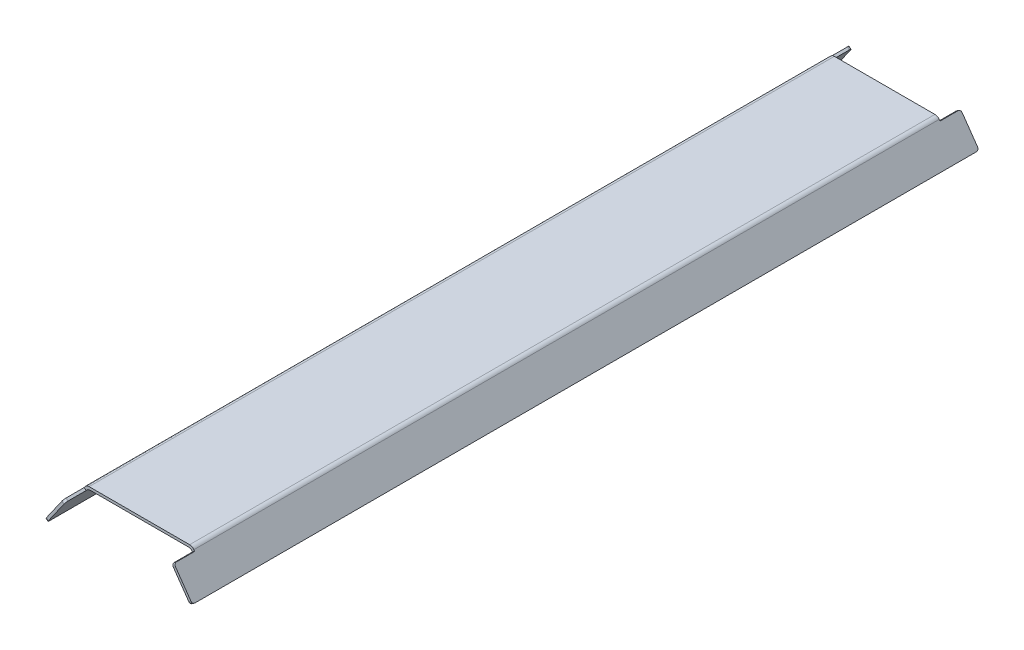
ISO-10303-21;
HEADER;
FILE_DESCRIPTION(('STEP AP214'),'2;1');
FILE_NAME('part.step','',(''),(''),'','','');
FILE_SCHEMA(('AUTOMOTIVE_DESIGN { 1 0 10303 214 1 1 1 1 }'));
ENDSEC;
DATA;
#1=APPLICATION_CONTEXT('core data for automotive mechanical design processes');
#2=APPLICATION_PROTOCOL_DEFINITION('international standard','automotive_design',2000,#1);
#3=PRODUCT_CONTEXT('',#1,'mechanical');
#4=PRODUCT('Part','Part','',(#3));
#5=PRODUCT_RELATED_PRODUCT_CATEGORY('part','',(#4));
#6=PRODUCT_DEFINITION_FORMATION('','',#4);
#7=PRODUCT_DEFINITION_CONTEXT('part definition',#1,'design');
#8=PRODUCT_DEFINITION('design','',#6,#7);
#9=PRODUCT_DEFINITION_SHAPE('','',#8);
#10=(LENGTH_UNIT() NAMED_UNIT(*) SI_UNIT(.MILLI.,.METRE.));
#11=(NAMED_UNIT(*) PLANE_ANGLE_UNIT() SI_UNIT($,.RADIAN.));
#12=(NAMED_UNIT(*) SI_UNIT($,.STERADIAN.) SOLID_ANGLE_UNIT());
#13=UNCERTAINTY_MEASURE_WITH_UNIT(LENGTH_MEASURE(1.E-05),#10,'distance_accuracy_value','');
#14=(GEOMETRIC_REPRESENTATION_CONTEXT(3) GLOBAL_UNCERTAINTY_ASSIGNED_CONTEXT((#13)) GLOBAL_UNIT_ASSIGNED_CONTEXT((#10,
#11,#12)) REPRESENTATION_CONTEXT('',''));
#15=CARTESIAN_POINT('',(0.,0.,0.));
#16=DIRECTION('',(0.,0.,1.));
#17=DIRECTION('',(1.,0.,0.));
#18=AXIS2_PLACEMENT_3D('',#15,#16,#17);
#19=CARTESIAN_POINT('',(-9.71439789499094,-1.,72.));
#20=DIRECTION('',(0.,0.,1.));
#21=DIRECTION('',(1.,0.,0.));
#22=AXIS2_PLACEMENT_3D('',#19,#20,#21);
#23=PLANE('',#22);
#24=DIRECTION('',(-0.573576436351045,-0.819152044288993,0.));
#25=VECTOR('',#24,1.);
#26=CARTESIAN_POINT('',(-10.5335499392799,-0.426423563648963,72.));
#27=LINE('',#26,#25);
#28=CARTESIAN_POINT('',(-10.5335499392799,-0.426423563648963,72.));
#29=VERTEX_POINT('',#28);
#30=CARTESIAN_POINT('',(-10.6828424361485,-0.639635345473422,72.));
#31=VERTEX_POINT('',#30);
#32=EDGE_CURVE('E343',#29,#31,#27,.T.);
#33=ORIENTED_EDGE('',*,*,#32,.T.);
#34=DIRECTION('',(0.819152044288993,-0.573576436351045,0.));
#35=VECTOR('',#34,1.);
#36=CARTESIAN_POINT('',(-10.6828424361485,-0.639635345473422,72.));
#37=LINE('',#36,#35);
#38=CARTESIAN_POINT('',(-10.2732664140041,-0.926423563648944,72.));
#39=VERTEX_POINT('',#38);
#40=EDGE_CURVE('E466',#31,#39,#37,.T.);
#41=ORIENTED_EDGE('',*,*,#40,.T.);
#42=CARTESIAN_POINT('',(-9.45411436971507,-1.5,72.));
#43=DIRECTION('',(0.,0.,-1.));
#44=DIRECTION('',(-1.,0.,0.));
#45=AXIS2_PLACEMENT_3D('',#42,#43,#44);
#46=CIRCLE('',#45,1.);
#47=CARTESIAN_POINT('',(-9.45411436971507,-0.500000000000002,72.));
#48=VERTEX_POINT('',#47);
#49=EDGE_CURVE('E347',#39,#48,#46,.T.);
#50=ORIENTED_EDGE('',*,*,#49,.T.);
#51=DIRECTION('',(-1.,0.,0.));
#52=VECTOR('',#51,1.);
#53=CARTESIAN_POINT('',(9.45411436971507,-0.5,72.));
#54=LINE('',#53,#52);
#55=CARTESIAN_POINT('',(9.45411436971507,-0.5,72.));
#56=VERTEX_POINT('',#55);
#57=EDGE_CURVE('E349',#56,#48,#54,.T.);
#58=ORIENTED_EDGE('',*,*,#57,.F.);
#59=CARTESIAN_POINT('',(9.45411436971507,-1.5,72.));
#60=DIRECTION('',(0.,0.,1.));
#61=DIRECTION('',(1.,0.,0.));
#62=AXIS2_PLACEMENT_3D('',#59,#60,#61);
#63=CIRCLE('',#62,1.);
#64=CARTESIAN_POINT('',(10.2732664140041,-0.926423563648956,72.));
#65=VERTEX_POINT('',#64);
#66=EDGE_CURVE('E352',#65,#56,#63,.T.);
#67=ORIENTED_EDGE('',*,*,#66,.F.);
#68=DIRECTION('',(-0.819152044288993,-0.573576436351045,0.));
#69=VECTOR('',#68,1.);
#70=CARTESIAN_POINT('',(10.6828424361486,-0.639635345473433,72.));
#71=LINE('',#70,#69);
#72=CARTESIAN_POINT('',(10.6828424361486,-0.639635345473434,72.));
#73=VERTEX_POINT('',#72);
#74=EDGE_CURVE('E73',#73,#65,#71,.T.);
#75=ORIENTED_EDGE('',*,*,#74,.F.);
#76=DIRECTION('',(-0.573576436351045,0.819152044288993,0.));
#77=VECTOR('',#76,1.);
#78=CARTESIAN_POINT('',(14.25,-5.73406431002295,72.));
#79=LINE('',#78,#77);
#80=CARTESIAN_POINT('',(10.5335499392799,-0.426423563648955,72.));
#81=VERTEX_POINT('',#80);
#82=EDGE_CURVE('E355',#73,#81,#79,.T.);
#83=ORIENTED_EDGE('',*,*,#82,.T.);
#84=CARTESIAN_POINT('',(9.71439789499094,-1.,72.));
#85=DIRECTION('',(0.,0.,1.));
#86=DIRECTION('',(1.,0.,0.));
#87=AXIS2_PLACEMENT_3D('',#84,#85,#86);
#88=CIRCLE('',#87,0.999999999999999);
#89=CARTESIAN_POINT('',(9.71439789499094,0.,72.));
#90=VERTEX_POINT('',#89);
#91=EDGE_CURVE('E358',#81,#90,#88,.T.);
#92=ORIENTED_EDGE('',*,*,#91,.T.);
#93=DIRECTION('',(-1.,0.,0.));
#94=VECTOR('',#93,1.);
#95=CARTESIAN_POINT('',(9.71439789499094,0.,72.));
#96=LINE('',#95,#94);
#97=CARTESIAN_POINT('',(-9.71439789499094,0.,72.));
#98=VERTEX_POINT('',#97);
#99=EDGE_CURVE('E385',#90,#98,#96,.T.);
#100=ORIENTED_EDGE('',*,*,#99,.T.);
#101=CARTESIAN_POINT('',(-9.71439789499094,-1.,72.));
#102=DIRECTION('',(0.,0.,1.));
#103=DIRECTION('',(1.,0.,0.));
#104=AXIS2_PLACEMENT_3D('',#101,#102,#103);
#105=CIRCLE('',#104,0.999999999999998);
#106=EDGE_CURVE('E340',#98,#29,#105,.T.);
#107=ORIENTED_EDGE('',*,*,#106,.T.);
#108=EDGE_LOOP('',(#33,#41,#50,#58,#67,#75,#83,#92,#100,#107));
#109=FACE_BOUND('',#108,.T.);
#110=ADVANCED_FACE('F48',(#109),#23,.T.);
#111=CARTESIAN_POINT('',(-9.71439789499094,-1.,-72.));
#112=DIRECTION('',(0.,0.,1.));
#113=DIRECTION('',(1.,0.,0.));
#114=AXIS2_PLACEMENT_3D('',#111,#112,#113);
#115=PLANE('',#114);
#116=DIRECTION('',(0.819152044288993,-0.573576436351045,0.));
#117=VECTOR('',#116,1.);
#118=CARTESIAN_POINT('',(-10.6828424361486,-0.639635345473436,-72.));
#119=LINE('',#118,#117);
#120=CARTESIAN_POINT('',(-10.6828424361486,-0.639635345473435,-72.));
#121=VERTEX_POINT('',#120);
#122=CARTESIAN_POINT('',(-10.2732664140041,-0.926423563648957,-72.));
#123=VERTEX_POINT('',#122);
#124=EDGE_CURVE('E65',#121,#123,#119,.T.);
#125=ORIENTED_EDGE('',*,*,#124,.F.);
#126=DIRECTION('',(-0.573576436351045,-0.819152044288993,0.));
#127=VECTOR('',#126,1.);
#128=CARTESIAN_POINT('',(-10.5335499392799,-0.426423563648963,-72.));
#129=LINE('',#128,#127);
#130=CARTESIAN_POINT('',(-10.5335499392799,-0.426423563648963,-72.));
#131=VERTEX_POINT('',#130);
#132=EDGE_CURVE('E427',#131,#121,#129,.T.);
#133=ORIENTED_EDGE('',*,*,#132,.F.);
#134=CARTESIAN_POINT('',(-9.71439789499094,-1.,-72.));
#135=DIRECTION('',(0.,0.,1.));
#136=DIRECTION('',(1.,0.,0.));
#137=AXIS2_PLACEMENT_3D('',#134,#135,#136);
#138=CIRCLE('',#137,0.999999999999998);
#139=CARTESIAN_POINT('',(-9.71439789499094,0.,-72.));
#140=VERTEX_POINT('',#139);
#141=EDGE_CURVE('E363',#140,#131,#138,.T.);
#142=ORIENTED_EDGE('',*,*,#141,.F.);
#143=DIRECTION('',(-1.,0.,0.));
#144=VECTOR('',#143,1.);
#145=CARTESIAN_POINT('',(9.71439789499094,0.,-72.));
#146=LINE('',#145,#144);
#147=CARTESIAN_POINT('',(9.71439789499094,0.,-72.));
#148=VERTEX_POINT('',#147);
#149=EDGE_CURVE('E344',#148,#140,#146,.T.);
#150=ORIENTED_EDGE('',*,*,#149,.F.);
#151=CARTESIAN_POINT('',(9.71439789499094,-1.,-72.));
#152=DIRECTION('',(0.,0.,1.));
#153=DIRECTION('',(1.,0.,0.));
#154=AXIS2_PLACEMENT_3D('',#151,#152,#153);
#155=CIRCLE('',#154,0.999999999999999);
#156=CARTESIAN_POINT('',(10.5335499392799,-0.426423563648955,-72.));
#157=VERTEX_POINT('',#156);
#158=EDGE_CURVE('E372',#157,#148,#155,.T.);
#159=ORIENTED_EDGE('',*,*,#158,.F.);
#160=DIRECTION('',(-0.573576436351045,0.819152044288993,0.));
#161=VECTOR('',#160,1.);
#162=CARTESIAN_POINT('',(14.25,-5.73406431002295,-72.));
#163=LINE('',#162,#161);
#164=CARTESIAN_POINT('',(10.6828424361486,-0.639635345473433,-72.));
#165=VERTEX_POINT('',#164);
#166=EDGE_CURVE('E369',#165,#157,#163,.T.);
#167=ORIENTED_EDGE('',*,*,#166,.F.);
#168=DIRECTION('',(-0.819152044288993,-0.573576436351045,0.));
#169=VECTOR('',#168,1.);
#170=CARTESIAN_POINT('',(10.6828424361486,-0.639635345473433,-72.));
#171=LINE('',#170,#169);
#172=CARTESIAN_POINT('',(10.2732664140041,-0.926423563648956,-72.));
#173=VERTEX_POINT('',#172);
#174=EDGE_CURVE('E282',#165,#173,#171,.T.);
#175=ORIENTED_EDGE('',*,*,#174,.T.);
#176=CARTESIAN_POINT('',(9.45411436971507,-1.5,-72.));
#177=DIRECTION('',(0.,0.,1.));
#178=DIRECTION('',(1.,0.,0.));
#179=AXIS2_PLACEMENT_3D('',#176,#177,#178);
#180=CIRCLE('',#179,1.);
#181=CARTESIAN_POINT('',(9.45411436971507,-0.5,-72.));
#182=VERTEX_POINT('',#181);
#183=EDGE_CURVE('E373',#173,#182,#180,.T.);
#184=ORIENTED_EDGE('',*,*,#183,.T.);
#185=DIRECTION('',(-1.,0.,0.));
#186=VECTOR('',#185,1.);
#187=CARTESIAN_POINT('',(9.45411436971507,-0.5,-72.));
#188=LINE('',#187,#186);
#189=CARTESIAN_POINT('',(-9.45411436971507,-0.500000000000002,-72.));
#190=VERTEX_POINT('',#189);
#191=EDGE_CURVE('E434',#182,#190,#188,.T.);
#192=ORIENTED_EDGE('',*,*,#191,.T.);
#193=CARTESIAN_POINT('',(-9.45411436971507,-1.5,-72.));
#194=DIRECTION('',(0.,0.,-1.));
#195=DIRECTION('',(-1.,0.,0.));
#196=AXIS2_PLACEMENT_3D('',#193,#194,#195);
#197=CIRCLE('',#196,1.);
#198=EDGE_CURVE('E431',#123,#190,#197,.T.);
#199=ORIENTED_EDGE('',*,*,#198,.F.);
#200=EDGE_LOOP('',(#125,#133,#142,#150,#159,#167,#175,#184,#192,#199));
#201=FACE_BOUND('',#200,.T.);
#202=ADVANCED_FACE('F442',(#201),#115,.F.);
#203=CARTESIAN_POINT('',(-9.71439789499094,-1.,72.));
#204=DIRECTION('',(0.,0.,-1.));
#205=DIRECTION('',(-1.,0.,0.));
#206=AXIS2_PLACEMENT_3D('',#203,#204,#205);
#207=CYLINDRICAL_SURFACE('',#206,0.999999999999998);
#208=ORIENTED_EDGE('',*,*,#141,.T.);
#209=DIRECTION('',(0.,0.,-1.));
#210=VECTOR('',#209,1.);
#211=CARTESIAN_POINT('',(-10.5335499392799,-0.426423563648963,72.));
#212=LINE('',#211,#210);
#213=EDGE_CURVE('E13',#29,#131,#212,.T.);
#214=ORIENTED_EDGE('',*,*,#213,.F.);
#215=ORIENTED_EDGE('',*,*,#106,.F.);
#216=DIRECTION('',(0.,0.,-1.));
#217=VECTOR('',#216,1.);
#218=CARTESIAN_POINT('',(-9.71439789499094,0.,72.));
#219=LINE('',#218,#217);
#220=EDGE_CURVE('E381',#98,#140,#219,.T.);
#221=ORIENTED_EDGE('',*,*,#220,.T.);
#222=EDGE_LOOP('',(#208,#214,#215,#221));
#223=FACE_BOUND('',#222,.T.);
#224=ADVANCED_FACE('F50',(#223),#207,.T.);
#225=CARTESIAN_POINT('',(-10.5335499392799,-0.426423563648963,72.));
#226=DIRECTION('',(0.819152044288993,-0.573576436351045,0.));
#227=DIRECTION('',(0.573576436351045,0.819152044288993,0.));
#228=AXIS2_PLACEMENT_3D('',#225,#226,#227);
#229=PLANE('',#228);
#230=ORIENTED_EDGE('',*,*,#132,.T.);
#231=DIRECTION('',(0.,0.,-1.));
#232=VECTOR('',#231,1.);
#233=CARTESIAN_POINT('',(-10.6828424361486,-0.639635345473436,-72.));
#234=LINE('',#233,#232);
#235=CARTESIAN_POINT('',(-10.6828424361486,-0.639635345473436,-75.5));
#236=VERTEX_POINT('',#235);
#237=EDGE_CURVE('E255',#121,#236,#234,.T.);
#238=ORIENTED_EDGE('',*,*,#237,.T.);
#239=CARTESIAN_POINT('',(-10.9696306543241,-1.04921136761793,-75.5));
#240=DIRECTION('',(-0.819152044288993,0.573576436351045,0.));
#241=DIRECTION('',(-0.573576436351045,-0.819152044288993,0.));
#242=AXIS2_PLACEMENT_3D('',#239,#240,#241);
#243=CIRCLE('',#242,0.500000000000001);
#244=CARTESIAN_POINT('',(-10.9696306543241,-1.04921136761793,-76.));
#245=VERTEX_POINT('',#244);
#246=EDGE_CURVE('E257',#236,#245,#243,.T.);
#247=ORIENTED_EDGE('',*,*,#246,.T.);
#248=DIRECTION('',(-0.573576436351044,-0.819152044288993,0.));
#249=VECTOR('',#248,1.);
#250=CARTESIAN_POINT('',(-10.9696306543241,-1.04921136761793,-76.));
#251=LINE('',#250,#249);
#252=CARTESIAN_POINT('',(-13.9632117818245,-5.32448828787846,-76.));
#253=VERTEX_POINT('',#252);
#254=EDGE_CURVE('E260',#245,#253,#251,.T.);
#255=ORIENTED_EDGE('',*,*,#254,.T.);
#256=CARTESIAN_POINT('',(-13.9632117818245,-5.32448828787846,-75.5));
#257=DIRECTION('',(-0.819152044288993,0.573576436351045,0.));
#258=DIRECTION('',(0.573576436351045,0.819152044288993,0.));
#259=AXIS2_PLACEMENT_3D('',#256,#257,#258);
#260=CIRCLE('',#259,0.5);
#261=CARTESIAN_POINT('',(-14.25,-5.73406431002295,-75.5));
#262=VERTEX_POINT('',#261);
#263=EDGE_CURVE('E228',#253,#262,#260,.T.);
#264=ORIENTED_EDGE('',*,*,#263,.T.);
#265=DIRECTION('',(0.,0.,-1.));
#266=VECTOR('',#265,1.);
#267=CARTESIAN_POINT('',(-14.25,-5.73406431002295,72.));
#268=LINE('',#267,#266);
#269=CARTESIAN_POINT('',(-14.25,-5.73406431002294,75.5));
#270=VERTEX_POINT('',#269);
#271=EDGE_CURVE('E57',#270,#262,#268,.T.);
#272=ORIENTED_EDGE('',*,*,#271,.F.);
#273=CARTESIAN_POINT('',(-13.9632117818245,-5.32448828787844,75.5));
#274=DIRECTION('',(-0.819152044288993,0.573576436351045,0.));
#275=DIRECTION('',(-0.573576436351045,-0.819152044288993,0.));
#276=AXIS2_PLACEMENT_3D('',#273,#274,#275);
#277=CIRCLE('',#276,0.500000000000007);
#278=CARTESIAN_POINT('',(-13.9632117818245,-5.32448828787844,76.));
#279=VERTEX_POINT('',#278);
#280=EDGE_CURVE('E225',#270,#279,#277,.T.);
#281=ORIENTED_EDGE('',*,*,#280,.T.);
#282=DIRECTION('',(0.573576436351044,0.819152044288993,0.));
#283=VECTOR('',#282,1.);
#284=CARTESIAN_POINT('',(-10.9696306543241,-1.04921136761792,76.));
#285=LINE('',#284,#283);
#286=CARTESIAN_POINT('',(-10.9696306543241,-1.04921136761792,76.));
#287=VERTEX_POINT('',#286);
#288=EDGE_CURVE('E242',#279,#287,#285,.T.);
#289=ORIENTED_EDGE('',*,*,#288,.T.);
#290=CARTESIAN_POINT('',(-10.9696306543241,-1.04921136761792,75.5));
#291=DIRECTION('',(-0.819152044288993,0.573576436351045,0.));
#292=DIRECTION('',(-0.573576436351045,-0.819152044288993,0.));
#293=AXIS2_PLACEMENT_3D('',#290,#291,#292);
#294=CIRCLE('',#293,0.5);
#295=CARTESIAN_POINT('',(-10.6828424361485,-0.639635345473421,75.5));
#296=VERTEX_POINT('',#295);
#297=EDGE_CURVE('E476',#287,#296,#294,.T.);
#298=ORIENTED_EDGE('',*,*,#297,.T.);
#299=DIRECTION('',(0.,0.,-1.));
#300=VECTOR('',#299,1.);
#301=CARTESIAN_POINT('',(-10.6828424361485,-0.639635345473422,72.));
#302=LINE('',#301,#300);
#303=EDGE_CURVE('E469',#296,#31,#302,.T.);
#304=ORIENTED_EDGE('',*,*,#303,.T.);
#305=ORIENTED_EDGE('',*,*,#32,.F.);
#306=ORIENTED_EDGE('',*,*,#213,.T.);
#307=EDGE_LOOP('',(#230,#238,#247,#255,#264,#272,#281,#289,#298,#304,#305,#306));
#308=FACE_BOUND('',#307,.T.);
#309=ADVANCED_FACE('F224',(#308),#229,.F.);
#310=CARTESIAN_POINT('',(-13.8404239778555,-6.02085252819847,72.));
#311=DIRECTION('',(-0.573576436351046,-0.819152044288992,0.));
#312=DIRECTION('',(0.819152044288992,-0.573576436351046,0.));
#313=AXIS2_PLACEMENT_3D('',#310,#311,#312);
#314=PLANE('',#313);
#315=ORIENTED_EDGE('',*,*,#271,.T.);
#316=DIRECTION('',(0.819152044288993,-0.573576436351045,0.));
#317=VECTOR('',#316,1.);
#318=CARTESIAN_POINT('',(-14.25,-5.73406431002295,-75.5));
#319=LINE('',#318,#317);
#320=CARTESIAN_POINT('',(-13.8404239778555,-6.02085252819847,-75.5));
#321=VERTEX_POINT('',#320);
#322=EDGE_CURVE('E262',#262,#321,#319,.T.);
#323=ORIENTED_EDGE('',*,*,#322,.T.);
#324=DIRECTION('',(0.,0.,-1.));
#325=VECTOR('',#324,1.);
#326=CARTESIAN_POINT('',(-13.8404239778555,-6.02085252819847,72.));
#327=LINE('',#326,#325);
#328=CARTESIAN_POINT('',(-13.8404239778555,-6.02085252819847,75.5));
#329=VERTEX_POINT('',#328);
#330=EDGE_CURVE('E233',#329,#321,#327,.T.);
#331=ORIENTED_EDGE('',*,*,#330,.F.);
#332=DIRECTION('',(0.819152044288993,-0.573576436351045,0.));
#333=VECTOR('',#332,1.);
#334=CARTESIAN_POINT('',(-14.25,-5.73406431002294,75.5));
#335=LINE('',#334,#333);
#336=EDGE_CURVE('E238',#270,#329,#335,.T.);
#337=ORIENTED_EDGE('',*,*,#336,.F.);
#338=EDGE_LOOP('',(#315,#323,#331,#337));
#339=FACE_BOUND('',#338,.T.);
#340=ADVANCED_FACE('F245',(#339),#314,.T.);
#341=CARTESIAN_POINT('',(-10.2732664140041,-0.926423563648957,72.));
#342=DIRECTION('',(0.819152044288993,-0.573576436351044,0.));
#343=DIRECTION('',(0.573576436351044,0.819152044288993,0.));
#344=AXIS2_PLACEMENT_3D('',#341,#342,#343);
#345=PLANE('',#344);
#346=ORIENTED_EDGE('',*,*,#330,.T.);
#347=CARTESIAN_POINT('',(-13.55363575968,-5.61127650605398,-75.5));
#348=DIRECTION('',(-0.819152044288993,0.573576436351045,0.));
#349=DIRECTION('',(0.573576436351045,0.819152044288993,0.));
#350=AXIS2_PLACEMENT_3D('',#347,#348,#349);
#351=CIRCLE('',#350,0.5);
#352=CARTESIAN_POINT('',(-13.55363575968,-5.61127650605398,-76.));
#353=VERTEX_POINT('',#352);
#354=EDGE_CURVE('E258',#353,#321,#351,.T.);
#355=ORIENTED_EDGE('',*,*,#354,.F.);
#356=DIRECTION('',(-0.573576436351044,-0.819152044288993,0.));
#357=VECTOR('',#356,1.);
#358=CARTESIAN_POINT('',(-10.5600546321796,-1.33599958579346,-76.));
#359=LINE('',#358,#357);
#360=CARTESIAN_POINT('',(-10.5600546321796,-1.33599958579346,-76.));
#361=VERTEX_POINT('',#360);
#362=EDGE_CURVE('E265',#361,#353,#359,.T.);
#363=ORIENTED_EDGE('',*,*,#362,.F.);
#364=CARTESIAN_POINT('',(-10.5600546321796,-1.33599958579346,-75.5));
#365=DIRECTION('',(-0.819152044288993,0.573576436351045,0.));
#366=DIRECTION('',(-0.573576436351045,-0.819152044288993,0.));
#367=AXIS2_PLACEMENT_3D('',#364,#365,#366);
#368=CIRCLE('',#367,0.500000000000001);
#369=CARTESIAN_POINT('',(-10.2732664140041,-0.926423563648958,-75.5));
#370=VERTEX_POINT('',#369);
#371=EDGE_CURVE('E249',#370,#361,#368,.T.);
#372=ORIENTED_EDGE('',*,*,#371,.F.);
#373=DIRECTION('',(0.,0.,-1.));
#374=VECTOR('',#373,1.);
#375=CARTESIAN_POINT('',(-10.2732664140041,-0.926423563648958,-72.));
#376=LINE('',#375,#374);
#377=EDGE_CURVE('E247',#123,#370,#376,.T.);
#378=ORIENTED_EDGE('',*,*,#377,.F.);
#379=DIRECTION('',(0.,0.,-1.));
#380=VECTOR('',#379,1.);
#381=CARTESIAN_POINT('',(-10.2732664140041,-0.926423563648957,72.));
#382=LINE('',#381,#380);
#383=EDGE_CURVE('E402',#39,#123,#382,.T.);
#384=ORIENTED_EDGE('',*,*,#383,.F.);
#385=DIRECTION('',(0.,0.,-1.));
#386=VECTOR('',#385,1.);
#387=CARTESIAN_POINT('',(-10.2732664140041,-0.926423563648944,72.));
#388=LINE('',#387,#386);
#389=CARTESIAN_POINT('',(-10.2732664140041,-0.926423563648944,75.5));
#390=VERTEX_POINT('',#389);
#391=EDGE_CURVE('E243',#390,#39,#388,.T.);
#392=ORIENTED_EDGE('',*,*,#391,.F.);
#393=CARTESIAN_POINT('',(-10.5600546321796,-1.33599958579344,75.5));
#394=DIRECTION('',(-0.819152044288993,0.573576436351045,0.));
#395=DIRECTION('',(-0.573576436351045,-0.819152044288993,0.));
#396=AXIS2_PLACEMENT_3D('',#393,#394,#395);
#397=CIRCLE('',#396,0.5);
#398=CARTESIAN_POINT('',(-10.5600546321796,-1.33599958579344,76.));
#399=VERTEX_POINT('',#398);
#400=EDGE_CURVE('E456',#399,#390,#397,.T.);
#401=ORIENTED_EDGE('',*,*,#400,.F.);
#402=DIRECTION('',(0.573576436351044,0.819152044288993,0.));
#403=VECTOR('',#402,1.);
#404=CARTESIAN_POINT('',(-10.5600546321796,-1.33599958579344,76.));
#405=LINE('',#404,#403);
#406=CARTESIAN_POINT('',(-13.55363575968,-5.61127650605396,76.));
#407=VERTEX_POINT('',#406);
#408=EDGE_CURVE('E462',#407,#399,#405,.T.);
#409=ORIENTED_EDGE('',*,*,#408,.F.);
#410=CARTESIAN_POINT('',(-13.55363575968,-5.61127650605396,75.5));
#411=DIRECTION('',(-0.819152044288993,0.573576436351045,0.));
#412=DIRECTION('',(-0.573576436351045,-0.819152044288993,0.));
#413=AXIS2_PLACEMENT_3D('',#410,#411,#412);
#414=CIRCLE('',#413,0.500000000000007);
#415=EDGE_CURVE('E409',#329,#407,#414,.T.);
#416=ORIENTED_EDGE('',*,*,#415,.F.);
#417=EDGE_LOOP('',(#346,#355,#363,#372,#378,#384,#392,#401,#409,#416));
#418=FACE_BOUND('',#417,.T.);
#419=ADVANCED_FACE('F406',(#418),#345,.T.);
#420=CARTESIAN_POINT('',(-9.45411436971507,-1.5,72.));
#421=DIRECTION('',(0.,0.,-1.));
#422=DIRECTION('',(-1.,0.,0.));
#423=AXIS2_PLACEMENT_3D('',#420,#421,#422);
#424=CYLINDRICAL_SURFACE('',#423,1.);
#425=ORIENTED_EDGE('',*,*,#198,.T.);
#426=DIRECTION('',(0.,0.,-1.));
#427=VECTOR('',#426,1.);
#428=CARTESIAN_POINT('',(-9.45411436971507,-0.500000000000002,72.));
#429=LINE('',#428,#427);
#430=EDGE_CURVE('E400',#48,#190,#429,.T.);
#431=ORIENTED_EDGE('',*,*,#430,.F.);
#432=ORIENTED_EDGE('',*,*,#49,.F.);
#433=ORIENTED_EDGE('',*,*,#383,.T.);
#434=EDGE_LOOP('',(#425,#431,#432,#433));
#435=FACE_BOUND('',#434,.T.);
#436=ADVANCED_FACE('F453',(#435),#424,.F.);
#437=CARTESIAN_POINT('',(9.45411436971507,-0.5,72.));
#438=DIRECTION('',(0.,-1.,0.));
#439=DIRECTION('',(1.,0.,0.));
#440=AXIS2_PLACEMENT_3D('',#437,#438,#439);
#441=PLANE('',#440);
#442=ORIENTED_EDGE('',*,*,#191,.F.);
#443=DIRECTION('',(0.,0.,-1.));
#444=VECTOR('',#443,1.);
#445=CARTESIAN_POINT('',(9.45411436971507,-0.5,72.));
#446=LINE('',#445,#444);
#447=EDGE_CURVE('E398',#56,#182,#446,.T.);
#448=ORIENTED_EDGE('',*,*,#447,.F.);
#449=ORIENTED_EDGE('',*,*,#57,.T.);
#450=ORIENTED_EDGE('',*,*,#430,.T.);
#451=EDGE_LOOP('',(#442,#448,#449,#450));
#452=FACE_BOUND('',#451,.T.);
#453=ADVANCED_FACE('F449',(#452),#441,.T.);
#454=CARTESIAN_POINT('',(9.45411436971507,-1.5,72.));
#455=DIRECTION('',(0.,0.,-1.));
#456=DIRECTION('',(-1.,0.,0.));
#457=AXIS2_PLACEMENT_3D('',#454,#455,#456);
#458=CYLINDRICAL_SURFACE('',#457,1.);
#459=ORIENTED_EDGE('',*,*,#183,.F.);
#460=DIRECTION('',(0.,0.,-1.));
#461=VECTOR('',#460,1.);
#462=CARTESIAN_POINT('',(10.2732664140041,-0.926423563648956,72.));
#463=LINE('',#462,#461);
#464=EDGE_CURVE('E395',#65,#173,#463,.T.);
#465=ORIENTED_EDGE('',*,*,#464,.F.);
#466=ORIENTED_EDGE('',*,*,#66,.T.);
#467=ORIENTED_EDGE('',*,*,#447,.T.);
#468=EDGE_LOOP('',(#459,#465,#466,#467));
#469=FACE_BOUND('',#468,.T.);
#470=ADVANCED_FACE('F446',(#469),#458,.F.);
#471=CARTESIAN_POINT('',(13.8404239778555,-6.02085252819847,72.));
#472=DIRECTION('',(-0.819152044288993,-0.573576436351044,0.));
#473=DIRECTION('',(0.573576436351044,-0.819152044288993,0.));
#474=AXIS2_PLACEMENT_3D('',#471,#472,#473);
#475=PLANE('',#474);
#476=ORIENTED_EDGE('',*,*,#464,.T.);
#477=DIRECTION('',(0.,0.,-1.));
#478=VECTOR('',#477,1.);
#479=CARTESIAN_POINT('',(10.2732664140041,-0.926423563648956,-72.));
#480=LINE('',#479,#478);
#481=CARTESIAN_POINT('',(10.2732664140041,-0.92642356364894,-75.5));
#482=VERTEX_POINT('',#481);
#483=EDGE_CURVE('E298',#173,#482,#480,.T.);
#484=ORIENTED_EDGE('',*,*,#483,.T.);
#485=CARTESIAN_POINT('',(10.5600546321796,-1.33599958579344,-75.5));
#486=DIRECTION('',(0.819152044288993,0.573576436351045,0.));
#487=DIRECTION('',(-0.573576436351045,0.819152044288993,0.));
#488=AXIS2_PLACEMENT_3D('',#485,#486,#487);
#489=CIRCLE('',#488,0.5);
#490=CARTESIAN_POINT('',(10.5600546321796,-1.33599958579344,-76.));
#491=VERTEX_POINT('',#490);
#492=EDGE_CURVE('E301',#491,#482,#489,.T.);
#493=ORIENTED_EDGE('',*,*,#492,.F.);
#494=DIRECTION('',(0.573576436351045,-0.819152044288993,0.));
#495=VECTOR('',#494,1.);
#496=CARTESIAN_POINT('',(10.5600546321796,-1.33599958579344,-76.));
#497=LINE('',#496,#495);
#498=CARTESIAN_POINT('',(13.55363575968,-5.61127650605397,-76.));
#499=VERTEX_POINT('',#498);
#500=EDGE_CURVE('E291',#491,#499,#497,.T.);
#501=ORIENTED_EDGE('',*,*,#500,.T.);
#502=CARTESIAN_POINT('',(13.55363575968,-5.61127650605397,-75.5));
#503=DIRECTION('',(0.819152044288993,0.573576436351045,0.));
#504=DIRECTION('',(-0.573576436351045,0.819152044288993,0.));
#505=AXIS2_PLACEMENT_3D('',#502,#503,#504);
#506=CIRCLE('',#505,0.499999999999985);
#507=CARTESIAN_POINT('',(13.8404239778555,-6.02085252819846,-75.5));
#508=VERTEX_POINT('',#507);
#509=EDGE_CURVE('E294',#508,#499,#506,.T.);
#510=ORIENTED_EDGE('',*,*,#509,.F.);
#511=DIRECTION('',(0.,0.,-1.));
#512=VECTOR('',#511,1.);
#513=CARTESIAN_POINT('',(13.8404239778555,-6.02085252819847,72.));
#514=LINE('',#513,#512);
#515=CARTESIAN_POINT('',(13.8404239778555,-6.02085252819847,75.5));
#516=VERTEX_POINT('',#515);
#517=EDGE_CURVE('E393',#516,#508,#514,.T.);
#518=ORIENTED_EDGE('',*,*,#517,.F.);
#519=CARTESIAN_POINT('',(13.55363575968,-5.61127650605399,75.5));
#520=DIRECTION('',(-0.819152044288993,-0.573576436351045,0.));
#521=DIRECTION('',(0.573576436351045,-0.819152044288993,0.));
#522=AXIS2_PLACEMENT_3D('',#519,#520,#521);
#523=CIRCLE('',#522,0.499999999999985);
#524=CARTESIAN_POINT('',(13.55363575968,-5.61127650605399,76.));
#525=VERTEX_POINT('',#524);
#526=EDGE_CURVE('E329',#516,#525,#523,.T.);
#527=ORIENTED_EDGE('',*,*,#526,.T.);
#528=DIRECTION('',(0.573576436351045,-0.819152044288992,0.));
#529=VECTOR('',#528,1.);
#530=CARTESIAN_POINT('',(10.5600546321796,-1.33599958579345,76.));
#531=LINE('',#530,#529);
#532=CARTESIAN_POINT('',(10.5600546321796,-1.33599958579345,76.));
#533=VERTEX_POINT('',#532);
#534=EDGE_CURVE('E326',#533,#525,#531,.T.);
#535=ORIENTED_EDGE('',*,*,#534,.F.);
#536=CARTESIAN_POINT('',(10.5600546321796,-1.33599958579345,75.5));
#537=DIRECTION('',(-0.819152044288993,-0.573576436351045,0.));
#538=DIRECTION('',(0.573576436351045,-0.819152044288993,0.));
#539=AXIS2_PLACEMENT_3D('',#536,#537,#538);
#540=CIRCLE('',#539,0.5);
#541=CARTESIAN_POINT('',(10.2732664140041,-0.926423563648955,75.5));
#542=VERTEX_POINT('',#541);
#543=EDGE_CURVE('E323',#533,#542,#540,.T.);
#544=ORIENTED_EDGE('',*,*,#543,.T.);
#545=DIRECTION('',(0.,0.,1.));
#546=VECTOR('',#545,1.);
#547=CARTESIAN_POINT('',(10.2732664140041,-0.926423563648956,72.));
#548=LINE('',#547,#546);
#549=EDGE_CURVE('E304',#65,#542,#548,.T.);
#550=ORIENTED_EDGE('',*,*,#549,.F.);
#551=EDGE_LOOP('',(#476,#484,#493,#501,#510,#518,#527,#535,#544,#550));
#552=FACE_BOUND('',#551,.T.);
#553=ADVANCED_FACE('F511',(#552),#475,.T.);
#554=CARTESIAN_POINT('',(13.8404239778555,-6.02085252819847,72.));
#555=DIRECTION('',(-0.573576436351045,0.819152044288993,0.));
#556=DIRECTION('',(-0.819152044288993,-0.573576436351045,0.));
#557=AXIS2_PLACEMENT_3D('',#554,#555,#556);
#558=PLANE('',#557);
#559=ORIENTED_EDGE('',*,*,#517,.T.);
#560=DIRECTION('',(-0.819152044288993,-0.573576436351045,0.));
#561=VECTOR('',#560,1.);
#562=CARTESIAN_POINT('',(14.25,-5.73406431002294,-75.5));
#563=LINE('',#562,#561);
#564=CARTESIAN_POINT('',(14.25,-5.73406431002294,-75.5));
#565=VERTEX_POINT('',#564);
#566=EDGE_CURVE('E283',#565,#508,#563,.T.);
#567=ORIENTED_EDGE('',*,*,#566,.F.);
#568=DIRECTION('',(0.,0.,-1.));
#569=VECTOR('',#568,1.);
#570=CARTESIAN_POINT('',(14.25,-5.73406431002295,72.));
#571=LINE('',#570,#569);
#572=CARTESIAN_POINT('',(14.25,-5.73406431002295,75.5));
#573=VERTEX_POINT('',#572);
#574=EDGE_CURVE('E391',#573,#565,#571,.T.);
#575=ORIENTED_EDGE('',*,*,#574,.F.);
#576=DIRECTION('',(-0.819152044288993,-0.573576436351045,0.));
#577=VECTOR('',#576,1.);
#578=CARTESIAN_POINT('',(14.25,-5.73406431002295,75.5));
#579=LINE('',#578,#577);
#580=EDGE_CURVE('E320',#573,#516,#579,.T.);
#581=ORIENTED_EDGE('',*,*,#580,.T.);
#582=EDGE_LOOP('',(#559,#567,#575,#581));
#583=FACE_BOUND('',#582,.T.);
#584=ADVANCED_FACE('F535',(#583),#558,.F.);
#585=CARTESIAN_POINT('',(14.25,-5.73406431002295,72.));
#586=DIRECTION('',(-0.819152044288993,-0.573576436351045,0.));
#587=DIRECTION('',(0.573576436351045,-0.819152044288993,0.));
#588=AXIS2_PLACEMENT_3D('',#585,#586,#587);
#589=PLANE('',#588);
#590=ORIENTED_EDGE('',*,*,#574,.T.);
#591=CARTESIAN_POINT('',(13.9632117818245,-5.32448828787845,-75.5));
#592=DIRECTION('',(0.819152044288993,0.573576436351045,0.));
#593=DIRECTION('',(-0.573576436351045,0.819152044288993,0.));
#594=AXIS2_PLACEMENT_3D('',#591,#592,#593);
#595=CIRCLE('',#594,0.499999999999985);
#596=CARTESIAN_POINT('',(13.9632117818245,-5.32448828787845,-76.));
#597=VERTEX_POINT('',#596);
#598=EDGE_CURVE('E307',#565,#597,#595,.T.);
#599=ORIENTED_EDGE('',*,*,#598,.T.);
#600=DIRECTION('',(0.573576436351045,-0.819152044288993,0.));
#601=VECTOR('',#600,1.);
#602=CARTESIAN_POINT('',(10.9696306543241,-1.04921136761791,-76.));
#603=LINE('',#602,#601);
#604=CARTESIAN_POINT('',(10.9696306543241,-1.04921136761791,-76.));
#605=VERTEX_POINT('',#604);
#606=EDGE_CURVE('E290',#605,#597,#603,.T.);
#607=ORIENTED_EDGE('',*,*,#606,.F.);
#608=CARTESIAN_POINT('',(10.9696306543241,-1.04921136761791,-75.5));
#609=DIRECTION('',(0.819152044288993,0.573576436351045,0.));
#610=DIRECTION('',(-0.573576436351045,0.819152044288993,0.));
#611=AXIS2_PLACEMENT_3D('',#608,#609,#610);
#612=CIRCLE('',#611,0.5);
#613=CARTESIAN_POINT('',(10.6828424361485,-0.639635345473418,-75.5));
#614=VERTEX_POINT('',#613);
#615=EDGE_CURVE('E295',#605,#614,#612,.T.);
#616=ORIENTED_EDGE('',*,*,#615,.T.);
#617=DIRECTION('',(0.,0.,-1.));
#618=VECTOR('',#617,1.);
#619=CARTESIAN_POINT('',(10.6828424361486,-0.639635345473433,-72.));
#620=LINE('',#619,#618);
#621=EDGE_CURVE('E309',#165,#614,#620,.T.);
#622=ORIENTED_EDGE('',*,*,#621,.F.);
#623=ORIENTED_EDGE('',*,*,#166,.T.);
#624=DIRECTION('',(0.,0.,-1.));
#625=VECTOR('',#624,1.);
#626=CARTESIAN_POINT('',(10.5335499392799,-0.426423563648955,72.));
#627=LINE('',#626,#625);
#628=EDGE_CURVE('E388',#81,#157,#627,.T.);
#629=ORIENTED_EDGE('',*,*,#628,.F.);
#630=ORIENTED_EDGE('',*,*,#82,.F.);
#631=DIRECTION('',(0.,0.,1.));
#632=VECTOR('',#631,1.);
#633=CARTESIAN_POINT('',(10.6828424361486,-0.639635345473433,72.));
#634=LINE('',#633,#632);
#635=CARTESIAN_POINT('',(10.6828424361486,-0.639635345473432,75.5));
#636=VERTEX_POINT('',#635);
#637=EDGE_CURVE('E315',#73,#636,#634,.T.);
#638=ORIENTED_EDGE('',*,*,#637,.T.);
#639=CARTESIAN_POINT('',(10.9696306543241,-1.04921136761793,75.5));
#640=DIRECTION('',(-0.819152044288993,-0.573576436351045,0.));
#641=DIRECTION('',(0.573576436351045,-0.819152044288993,0.));
#642=AXIS2_PLACEMENT_3D('',#639,#640,#641);
#643=CIRCLE('',#642,0.5);
#644=CARTESIAN_POINT('',(10.9696306543241,-1.04921136761793,76.));
#645=VERTEX_POINT('',#644);
#646=EDGE_CURVE('E311',#645,#636,#643,.T.);
#647=ORIENTED_EDGE('',*,*,#646,.F.);
#648=DIRECTION('',(0.573576436351045,-0.819152044288992,0.));
#649=VECTOR('',#648,1.);
#650=CARTESIAN_POINT('',(10.9696306543241,-1.04921136761793,76.));
#651=LINE('',#650,#649);
#652=CARTESIAN_POINT('',(13.9632117818245,-5.32448828787847,76.));
#653=VERTEX_POINT('',#652);
#654=EDGE_CURVE('E314',#645,#653,#651,.T.);
#655=ORIENTED_EDGE('',*,*,#654,.T.);
#656=CARTESIAN_POINT('',(13.9632117818245,-5.32448828787847,75.5));
#657=DIRECTION('',(-0.819152044288993,-0.573576436351045,0.));
#658=DIRECTION('',(0.573576436351045,-0.819152044288993,0.));
#659=AXIS2_PLACEMENT_3D('',#656,#657,#658);
#660=CIRCLE('',#659,0.499999999999985);
#661=EDGE_CURVE('E317',#573,#653,#660,.T.);
#662=ORIENTED_EDGE('',*,*,#661,.F.);
#663=EDGE_LOOP('',(#590,#599,#607,#616,#622,#623,#629,#630,#638,#647,#655,#662));
#664=FACE_BOUND('',#663,.T.);
#665=ADVANCED_FACE('F499',(#664),#589,.F.);
#666=CARTESIAN_POINT('',(9.71439789499094,-1.,72.));
#667=DIRECTION('',(0.,0.,-1.));
#668=DIRECTION('',(-1.,0.,0.));
#669=AXIS2_PLACEMENT_3D('',#666,#667,#668);
#670=CYLINDRICAL_SURFACE('',#669,0.999999999999999);
#671=ORIENTED_EDGE('',*,*,#158,.T.);
#672=DIRECTION('',(0.,0.,-1.));
#673=VECTOR('',#672,1.);
#674=CARTESIAN_POINT('',(9.71439789499094,0.,72.));
#675=LINE('',#674,#673);
#676=EDGE_CURVE('E384',#90,#148,#675,.T.);
#677=ORIENTED_EDGE('',*,*,#676,.F.);
#678=ORIENTED_EDGE('',*,*,#91,.F.);
#679=ORIENTED_EDGE('',*,*,#628,.T.);
#680=EDGE_LOOP('',(#671,#677,#678,#679));
#681=FACE_BOUND('',#680,.T.);
#682=ADVANCED_FACE('F496',(#681),#670,.T.);
#683=CARTESIAN_POINT('',(9.71439789499094,0.,72.));
#684=DIRECTION('',(0.,-1.,0.));
#685=DIRECTION('',(0.,0.,-1.));
#686=AXIS2_PLACEMENT_3D('',#683,#684,#685);
#687=PLANE('',#686);
#688=ORIENTED_EDGE('',*,*,#149,.T.);
#689=ORIENTED_EDGE('',*,*,#220,.F.);
#690=ORIENTED_EDGE('',*,*,#99,.F.);
#691=ORIENTED_EDGE('',*,*,#676,.T.);
#692=EDGE_LOOP('',(#688,#689,#690,#691));
#693=FACE_BOUND('',#692,.T.);
#694=ADVANCED_FACE('F492',(#693),#687,.F.);
#695=CARTESIAN_POINT('',(10.6828424361486,-0.639635345473433,72.));
#696=DIRECTION('',(0.573576436351045,-0.819152044288993,0.));
#697=DIRECTION('',(0.819152044288993,0.573576436351045,0.));
#698=AXIS2_PLACEMENT_3D('',#695,#696,#697);
#699=PLANE('',#698);
#700=ORIENTED_EDGE('',*,*,#549,.T.);
#701=DIRECTION('',(-0.819152044288993,-0.573576436351045,0.));
#702=VECTOR('',#701,1.);
#703=CARTESIAN_POINT('',(10.6828424361486,-0.639635345473432,75.5));
#704=LINE('',#703,#702);
#705=EDGE_CURVE('E338',#636,#542,#704,.T.);
#706=ORIENTED_EDGE('',*,*,#705,.F.);
#707=ORIENTED_EDGE('',*,*,#637,.F.);
#708=ORIENTED_EDGE('',*,*,#74,.T.);
#709=EDGE_LOOP('',(#700,#706,#707,#708));
#710=FACE_BOUND('',#709,.T.);
#711=ADVANCED_FACE('F518',(#710),#699,.F.);
#712=CARTESIAN_POINT('',(10.9696306543241,-1.04921136761793,75.5));
#713=DIRECTION('',(-0.819152044288993,-0.573576436351045,0.));
#714=DIRECTION('',(0.573576436351045,-0.819152044288993,0.));
#715=AXIS2_PLACEMENT_3D('',#712,#713,#714);
#716=CYLINDRICAL_SURFACE('',#715,0.5);
#717=ORIENTED_EDGE('',*,*,#543,.F.);
#718=DIRECTION('',(-0.819152044288993,-0.573576436351045,0.));
#719=VECTOR('',#718,1.);
#720=CARTESIAN_POINT('',(10.9696306543241,-1.04921136761793,76.));
#721=LINE('',#720,#719);
#722=EDGE_CURVE('E336',#645,#533,#721,.T.);
#723=ORIENTED_EDGE('',*,*,#722,.F.);
#724=ORIENTED_EDGE('',*,*,#646,.T.);
#725=ORIENTED_EDGE('',*,*,#705,.T.);
#726=EDGE_LOOP('',(#717,#723,#724,#725));
#727=FACE_BOUND('',#726,.T.);
#728=ADVANCED_FACE('F524',(#727),#716,.T.);
#729=CARTESIAN_POINT('',(10.9696306543241,-1.04921136761793,76.));
#730=DIRECTION('',(0.,0.,-1.));
#731=DIRECTION('',(0.,1.,0.));
#732=AXIS2_PLACEMENT_3D('',#729,#730,#731);
#733=PLANE('',#732);
#734=ORIENTED_EDGE('',*,*,#534,.T.);
#735=DIRECTION('',(-0.819152044288993,-0.573576436351045,0.));
#736=VECTOR('',#735,1.);
#737=CARTESIAN_POINT('',(13.9632117818245,-5.32448828787847,76.));
#738=LINE('',#737,#736);
#739=EDGE_CURVE('E334',#653,#525,#738,.T.);
#740=ORIENTED_EDGE('',*,*,#739,.F.);
#741=ORIENTED_EDGE('',*,*,#654,.F.);
#742=ORIENTED_EDGE('',*,*,#722,.T.);
#743=EDGE_LOOP('',(#734,#740,#741,#742));
#744=FACE_BOUND('',#743,.T.);
#745=ADVANCED_FACE('F526',(#744),#733,.F.);
#746=CARTESIAN_POINT('',(13.9632117818245,-5.32448828787847,75.5));
#747=DIRECTION('',(-0.819152044288993,-0.573576436351045,0.));
#748=DIRECTION('',(0.573576436351045,-0.819152044288993,0.));
#749=AXIS2_PLACEMENT_3D('',#746,#747,#748);
#750=CYLINDRICAL_SURFACE('',#749,0.499999999999985);
#751=ORIENTED_EDGE('',*,*,#526,.F.);
#752=ORIENTED_EDGE('',*,*,#580,.F.);
#753=ORIENTED_EDGE('',*,*,#661,.T.);
#754=ORIENTED_EDGE('',*,*,#739,.T.);
#755=EDGE_LOOP('',(#751,#752,#753,#754));
#756=FACE_BOUND('',#755,.T.);
#757=ADVANCED_FACE('F530',(#756),#750,.T.);
#758=CARTESIAN_POINT('',(10.9696306543241,-1.04921136761791,-75.5));
#759=DIRECTION('',(-0.819152044288993,-0.573576436351045,0.));
#760=DIRECTION('',(0.573576436351045,-0.819152044288993,0.));
#761=AXIS2_PLACEMENT_3D('',#758,#759,#760);
#762=CYLINDRICAL_SURFACE('',#761,0.5);
#763=ORIENTED_EDGE('',*,*,#492,.T.);
#764=DIRECTION('',(-0.819152044288993,-0.573576436351045,0.));
#765=VECTOR('',#764,1.);
#766=CARTESIAN_POINT('',(10.6828424361485,-0.639635345473418,-75.5));
#767=LINE('',#766,#765);
#768=EDGE_CURVE('E280',#614,#482,#767,.T.);
#769=ORIENTED_EDGE('',*,*,#768,.F.);
#770=ORIENTED_EDGE('',*,*,#615,.F.);
#771=DIRECTION('',(-0.819152044288993,-0.573576436351045,0.));
#772=VECTOR('',#771,1.);
#773=CARTESIAN_POINT('',(10.9696306543241,-1.04921136761791,-76.));
#774=LINE('',#773,#772);
#775=EDGE_CURVE('E288',#605,#491,#774,.T.);
#776=ORIENTED_EDGE('',*,*,#775,.T.);
#777=EDGE_LOOP('',(#763,#769,#770,#776));
#778=FACE_BOUND('',#777,.T.);
#779=ADVANCED_FACE('F542',(#778),#762,.T.);
#780=CARTESIAN_POINT('',(10.6828424361486,-0.639635345473433,-72.));
#781=DIRECTION('',(-0.573576436351045,0.819152044288993,0.));
#782=DIRECTION('',(-0.819152044288993,-0.573576436351045,0.));
#783=AXIS2_PLACEMENT_3D('',#780,#781,#782);
#784=PLANE('',#783);
#785=ORIENTED_EDGE('',*,*,#483,.F.);
#786=ORIENTED_EDGE('',*,*,#174,.F.);
#787=ORIENTED_EDGE('',*,*,#621,.T.);
#788=ORIENTED_EDGE('',*,*,#768,.T.);
#789=EDGE_LOOP('',(#785,#786,#787,#788));
#790=FACE_BOUND('',#789,.T.);
#791=ADVANCED_FACE('F508',(#790),#784,.T.);
#792=CARTESIAN_POINT('',(13.9632117818245,-5.32448828787845,-75.5));
#793=DIRECTION('',(-0.819152044288993,-0.573576436351045,0.));
#794=DIRECTION('',(0.573576436351045,-0.819152044288993,0.));
#795=AXIS2_PLACEMENT_3D('',#792,#793,#794);
#796=CYLINDRICAL_SURFACE('',#795,0.499999999999985);
#797=ORIENTED_EDGE('',*,*,#509,.T.);
#798=DIRECTION('',(-0.819152044288993,-0.573576436351045,0.));
#799=VECTOR('',#798,1.);
#800=CARTESIAN_POINT('',(13.9632117818245,-5.32448828787845,-76.));
#801=LINE('',#800,#799);
#802=EDGE_CURVE('E286',#597,#499,#801,.T.);
#803=ORIENTED_EDGE('',*,*,#802,.F.);
#804=ORIENTED_EDGE('',*,*,#598,.F.);
#805=ORIENTED_EDGE('',*,*,#566,.T.);
#806=EDGE_LOOP('',(#797,#803,#804,#805));
#807=FACE_BOUND('',#806,.T.);
#808=ADVANCED_FACE('F538',(#807),#796,.T.);
#809=CARTESIAN_POINT('',(10.9696306543241,-1.04921136761791,-76.));
#810=DIRECTION('',(0.,0.,-1.));
#811=DIRECTION('',(0.,1.,0.));
#812=AXIS2_PLACEMENT_3D('',#809,#810,#811);
#813=PLANE('',#812);
#814=ORIENTED_EDGE('',*,*,#500,.F.);
#815=ORIENTED_EDGE('',*,*,#775,.F.);
#816=ORIENTED_EDGE('',*,*,#606,.T.);
#817=ORIENTED_EDGE('',*,*,#802,.T.);
#818=EDGE_LOOP('',(#814,#815,#816,#817));
#819=FACE_BOUND('',#818,.T.);
#820=ADVANCED_FACE('F540',(#819),#813,.T.);
#821=CARTESIAN_POINT('',(-10.6828424361486,-0.639635345473436,-72.));
#822=DIRECTION('',(-0.573576436351044,-0.819152044288993,0.));
#823=DIRECTION('',(0.819152044288993,-0.573576436351044,0.));
#824=AXIS2_PLACEMENT_3D('',#821,#822,#823);
#825=PLANE('',#824);
#826=ORIENTED_EDGE('',*,*,#377,.T.);
#827=DIRECTION('',(0.819152044288993,-0.573576436351045,0.));
#828=VECTOR('',#827,1.);
#829=CARTESIAN_POINT('',(-10.6828424361486,-0.639635345473436,-75.5));
#830=LINE('',#829,#828);
#831=EDGE_CURVE('E276',#236,#370,#830,.T.);
#832=ORIENTED_EDGE('',*,*,#831,.F.);
#833=ORIENTED_EDGE('',*,*,#237,.F.);
#834=ORIENTED_EDGE('',*,*,#124,.T.);
#835=EDGE_LOOP('',(#826,#832,#833,#834));
#836=FACE_BOUND('',#835,.T.);
#837=ADVANCED_FACE('F426',(#836),#825,.F.);
#838=CARTESIAN_POINT('',(-10.9696306543241,-1.04921136761793,-75.5));
#839=DIRECTION('',(0.819152044288993,-0.573576436351045,0.));
#840=DIRECTION('',(0.573576436351045,0.819152044288993,0.));
#841=AXIS2_PLACEMENT_3D('',#838,#839,#840);
#842=CYLINDRICAL_SURFACE('',#841,0.500000000000001);
#843=ORIENTED_EDGE('',*,*,#371,.T.);
#844=DIRECTION('',(0.819152044288993,-0.573576436351045,0.));
#845=VECTOR('',#844,1.);
#846=CARTESIAN_POINT('',(-10.9696306543241,-1.04921136761793,-76.));
#847=LINE('',#846,#845);
#848=EDGE_CURVE('E273',#245,#361,#847,.T.);
#849=ORIENTED_EDGE('',*,*,#848,.F.);
#850=ORIENTED_EDGE('',*,*,#246,.F.);
#851=ORIENTED_EDGE('',*,*,#831,.T.);
#852=EDGE_LOOP('',(#843,#849,#850,#851));
#853=FACE_BOUND('',#852,.T.);
#854=ADVANCED_FACE('F421',(#853),#842,.T.);
#855=CARTESIAN_POINT('',(-10.9696306543241,-1.04921136761793,-76.));
#856=DIRECTION('',(0.,0.,1.));
#857=DIRECTION('',(1.,0.,0.));
#858=AXIS2_PLACEMENT_3D('',#855,#856,#857);
#859=PLANE('',#858);
#860=ORIENTED_EDGE('',*,*,#362,.T.);
#861=DIRECTION('',(0.819152044288993,-0.573576436351045,0.));
#862=VECTOR('',#861,1.);
#863=CARTESIAN_POINT('',(-13.9632117818245,-5.32448828787846,-76.));
#864=LINE('',#863,#862);
#865=EDGE_CURVE('E270',#253,#353,#864,.T.);
#866=ORIENTED_EDGE('',*,*,#865,.F.);
#867=ORIENTED_EDGE('',*,*,#254,.F.);
#868=ORIENTED_EDGE('',*,*,#848,.T.);
#869=EDGE_LOOP('',(#860,#866,#867,#868));
#870=FACE_BOUND('',#869,.T.);
#871=ADVANCED_FACE('F415',(#870),#859,.F.);
#872=CARTESIAN_POINT('',(-13.9632117818245,-5.32448828787846,-75.5));
#873=DIRECTION('',(0.819152044288993,-0.573576436351045,0.));
#874=DIRECTION('',(0.573576436351045,0.819152044288993,0.));
#875=AXIS2_PLACEMENT_3D('',#872,#873,#874);
#876=CYLINDRICAL_SURFACE('',#875,0.5);
#877=ORIENTED_EDGE('',*,*,#354,.T.);
#878=ORIENTED_EDGE('',*,*,#322,.F.);
#879=ORIENTED_EDGE('',*,*,#263,.F.);
#880=ORIENTED_EDGE('',*,*,#865,.T.);
#881=EDGE_LOOP('',(#877,#878,#879,#880));
#882=FACE_BOUND('',#881,.T.);
#883=ADVANCED_FACE('F411',(#882),#876,.T.);
#884=CARTESIAN_POINT('',(-13.9632117818245,-5.32448828787844,75.5));
#885=DIRECTION('',(0.819152044288993,-0.573576436351045,0.));
#886=DIRECTION('',(0.573576436351045,0.819152044288993,0.));
#887=AXIS2_PLACEMENT_3D('',#884,#885,#886);
#888=CYLINDRICAL_SURFACE('',#887,0.500000000000007);
#889=ORIENTED_EDGE('',*,*,#415,.T.);
#890=DIRECTION('',(0.819152044288993,-0.573576436351045,0.));
#891=VECTOR('',#890,1.);
#892=CARTESIAN_POINT('',(-13.9632117818245,-5.32448828787844,76.));
#893=LINE('',#892,#891);
#894=EDGE_CURVE('E240',#279,#407,#893,.T.);
#895=ORIENTED_EDGE('',*,*,#894,.F.);
#896=ORIENTED_EDGE('',*,*,#280,.F.);
#897=ORIENTED_EDGE('',*,*,#336,.T.);
#898=EDGE_LOOP('',(#889,#895,#896,#897));
#899=FACE_BOUND('',#898,.T.);
#900=ADVANCED_FACE('F237',(#899),#888,.T.);
#901=CARTESIAN_POINT('',(-10.9696306543241,-1.04921136761792,76.));
#902=DIRECTION('',(0.,0.,-1.));
#903=DIRECTION('',(0.,1.,0.));
#904=AXIS2_PLACEMENT_3D('',#901,#902,#903);
#905=PLANE('',#904);
#906=ORIENTED_EDGE('',*,*,#408,.T.);
#907=DIRECTION('',(0.819152044288993,-0.573576436351045,0.));
#908=VECTOR('',#907,1.);
#909=CARTESIAN_POINT('',(-10.9696306543241,-1.04921136761792,76.));
#910=LINE('',#909,#908);
#911=EDGE_CURVE('E251',#287,#399,#910,.T.);
#912=ORIENTED_EDGE('',*,*,#911,.F.);
#913=ORIENTED_EDGE('',*,*,#288,.F.);
#914=ORIENTED_EDGE('',*,*,#894,.T.);
#915=EDGE_LOOP('',(#906,#912,#913,#914));
#916=FACE_BOUND('',#915,.T.);
#917=ADVANCED_FACE('F478',(#916),#905,.F.);
#918=CARTESIAN_POINT('',(-10.9696306543241,-1.04921136761792,75.5));
#919=DIRECTION('',(0.819152044288993,-0.573576436351045,0.));
#920=DIRECTION('',(0.573576436351045,0.819152044288993,0.));
#921=AXIS2_PLACEMENT_3D('',#918,#919,#920);
#922=CYLINDRICAL_SURFACE('',#921,0.5);
#923=ORIENTED_EDGE('',*,*,#400,.T.);
#924=DIRECTION('',(0.819152044288993,-0.573576436351045,0.));
#925=VECTOR('',#924,1.);
#926=CARTESIAN_POINT('',(-10.6828424361485,-0.639635345473421,75.5));
#927=LINE('',#926,#925);
#928=EDGE_CURVE('E468',#296,#390,#927,.T.);
#929=ORIENTED_EDGE('',*,*,#928,.F.);
#930=ORIENTED_EDGE('',*,*,#297,.F.);
#931=ORIENTED_EDGE('',*,*,#911,.T.);
#932=EDGE_LOOP('',(#923,#929,#930,#931));
#933=FACE_BOUND('',#932,.T.);
#934=ADVANCED_FACE('F474',(#933),#922,.T.);
#935=CARTESIAN_POINT('',(-10.6828424361485,-0.639635345473422,72.));
#936=DIRECTION('',(-0.573576436351044,-0.819152044288993,0.));
#937=DIRECTION('',(0.819152044288993,-0.573576436351044,0.));
#938=AXIS2_PLACEMENT_3D('',#935,#936,#937);
#939=PLANE('',#938);
#940=ORIENTED_EDGE('',*,*,#391,.T.);
#941=ORIENTED_EDGE('',*,*,#40,.F.);
#942=ORIENTED_EDGE('',*,*,#303,.F.);
#943=ORIENTED_EDGE('',*,*,#928,.T.);
#944=EDGE_LOOP('',(#940,#941,#942,#943));
#945=FACE_BOUND('',#944,.T.);
#946=ADVANCED_FACE('F484',(#945),#939,.F.);
#947=CLOSED_SHELL('',(#110,#202,#224,#309,#340,#419,#436,#453,#470,#553,#584,#665,#682,#694,
#711,#728,#745,#757,#779,#791,#808,#820,#837,#854,#871,#883,#900,#917,#934,#946));
#948=MANIFOLD_SOLID_BREP('B2',#947);
#949=ADVANCED_BREP_SHAPE_REPRESENTATION('',(#18,#948),#14);
#950=SHAPE_DEFINITION_REPRESENTATION(#9,#949);
ENDSEC;
END-ISO-10303-21;
